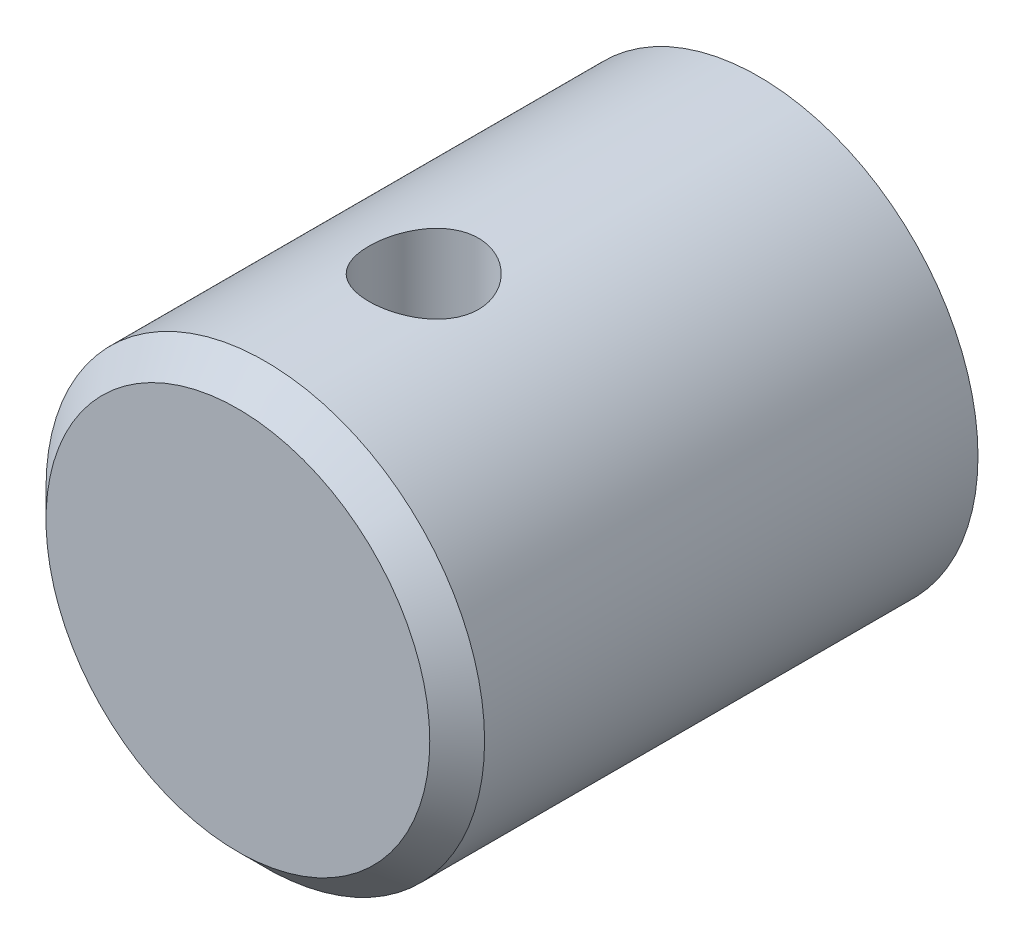
ISO-10303-21;
HEADER;
FILE_DESCRIPTION(('STEP AP214'),'2;1');
FILE_NAME('part.step','',(''),(''),'','','');
FILE_SCHEMA(('AUTOMOTIVE_DESIGN { 1 0 10303 214 1 1 1 1 }'));
ENDSEC;
DATA;
#1=APPLICATION_CONTEXT('core data for automotive mechanical design processes');
#2=APPLICATION_PROTOCOL_DEFINITION('international standard','automotive_design',2000,#1);
#3=PRODUCT_CONTEXT('',#1,'mechanical');
#4=PRODUCT('Part','Part','',(#3));
#5=PRODUCT_RELATED_PRODUCT_CATEGORY('part','',(#4));
#6=PRODUCT_DEFINITION_FORMATION('','',#4);
#7=PRODUCT_DEFINITION_CONTEXT('part definition',#1,'design');
#8=PRODUCT_DEFINITION('design','',#6,#7);
#9=PRODUCT_DEFINITION_SHAPE('','',#8);
#10=(LENGTH_UNIT() NAMED_UNIT(*) SI_UNIT(.MILLI.,.METRE.));
#11=(NAMED_UNIT(*) PLANE_ANGLE_UNIT() SI_UNIT($,.RADIAN.));
#12=(NAMED_UNIT(*) SI_UNIT($,.STERADIAN.) SOLID_ANGLE_UNIT());
#13=UNCERTAINTY_MEASURE_WITH_UNIT(LENGTH_MEASURE(1.E-05),#10,'distance_accuracy_value','');
#14=(GEOMETRIC_REPRESENTATION_CONTEXT(3) GLOBAL_UNCERTAINTY_ASSIGNED_CONTEXT((#13)) GLOBAL_UNIT_ASSIGNED_CONTEXT((#10,
#11,#12)) REPRESENTATION_CONTEXT('',''));
#15=CARTESIAN_POINT('',(0.,0.,0.));
#16=DIRECTION('',(0.,0.,1.));
#17=DIRECTION('',(1.,0.,0.));
#18=AXIS2_PLACEMENT_3D('',#15,#16,#17);
#19=CARTESIAN_POINT('',(0.,0.,19.));
#20=DIRECTION('',(0.,0.,-1.));
#21=DIRECTION('',(-1.,0.,0.));
#22=AXIS2_PLACEMENT_3D('',#19,#20,#21);
#23=CYLINDRICAL_SURFACE('',#22,8.00000000000001);
#24=CARTESIAN_POINT('',(0.,0.,18.));
#25=DIRECTION('',(0.,0.,1.));
#26=DIRECTION('',(1.,0.,0.));
#27=AXIS2_PLACEMENT_3D('',#24,#25,#26);
#28=CIRCLE('',#27,8.00000000000001);
#29=CARTESIAN_POINT('',(8.00000000000001,0.,18.));
#30=VERTEX_POINT('',#29);
#31=EDGE_CURVE('E10',#30,#30,#28,.F.);
#32=ORIENTED_EDGE('',*,*,#31,.T.);
#33=EDGE_LOOP('',(#32));
#34=FACE_BOUND('',#33,.T.);
#35=CARTESIAN_POINT('',(0.,-8.00000000000001,14.2213121535534));
#36=CARTESIAN_POINT('',(0.110501451559641,-7.9999981315735,14.2213090525692));
#37=CARTESIAN_POINT('',(0.221037543774351,-7.99768770842436,14.2121234191884));
#38=CARTESIAN_POINT('',(0.438941765027376,-7.98869485106526,14.1756786184774));
#39=CARTESIAN_POINT('',(0.546308062494318,-7.98200993893302,14.1484092075029));
#40=CARTESIAN_POINT('',(0.754694496243435,-7.96500835109377,14.0767264822706));
#41=CARTESIAN_POINT('',(0.855722084573336,-7.95469603789412,14.0323337552664));
#42=CARTESIAN_POINT('',(1.04889617587257,-7.93153791743496,13.927736966827));
#43=CARTESIAN_POINT('',(1.14104237913168,-7.91869202472209,13.8675323720614));
#44=CARTESIAN_POINT('',(1.31573590306789,-7.89156551455592,13.7317111006812));
#45=CARTESIAN_POINT('',(1.39807425341474,-7.87726276197502,13.655830053608));
#46=CARTESIAN_POINT('',(1.54899856960443,-7.84898160157249,13.4913758803414));
#47=CARTESIAN_POINT('',(1.61758298259892,-7.83500323053157,13.4028013229575));
#48=CARTESIAN_POINT('',(1.74003539039863,-7.80873034264225,13.2138518512374));
#49=CARTESIAN_POINT('',(1.79366962123352,-7.79646392619749,13.1133211791418));
#50=CARTESIAN_POINT('',(1.88319587806766,-7.77532659757356,12.90431427134));
#51=CARTESIAN_POINT('',(1.91909074058685,-7.76645514259225,12.7958393091107));
#52=CARTESIAN_POINT('',(1.97140644907302,-7.75333968928431,12.5763208226179));
#53=CARTESIAN_POINT('',(1.98820302444274,-7.74900654662682,12.4653722921694));
#54=CARTESIAN_POINT('',(2.00301570008854,-7.74519149946123,12.2421540615543));
#55=CARTESIAN_POINT('',(2.00103485575748,-7.74570880570572,12.1298845792972));
#56=CARTESIAN_POINT('',(1.97864869951961,-7.75145607355757,11.9100910765596));
#57=CARTESIAN_POINT('',(1.95869112025418,-7.75657150676392,11.8025179915996));
#58=CARTESIAN_POINT('',(1.90163224920399,-7.77075612894759,11.5922974190053));
#59=CARTESIAN_POINT('',(1.86452973609252,-7.77982559958985,11.4896502828482));
#60=CARTESIAN_POINT('',(1.77385263724958,-7.80100151874213,11.2909947985506));
#61=CARTESIAN_POINT('',(1.72011555631056,-7.81313769959755,11.1950639245006));
#62=CARTESIAN_POINT('',(1.59780836801993,-7.83906281127989,11.0134205405443));
#63=CARTESIAN_POINT('',(1.52923566507845,-7.85285203112838,10.9277098227971));
#64=CARTESIAN_POINT('',(1.37688456624163,-7.88101174053189,10.7663739992942));
#65=CARTESIAN_POINT('',(1.29272834422115,-7.89538759304002,10.6911061668049));
#66=CARTESIAN_POINT('',(1.11281589000493,-7.92274620771676,10.5556838302682));
#67=CARTESIAN_POINT('',(1.01705930361059,-7.93572892732544,10.4955297878686));
#68=CARTESIAN_POINT('',(0.816154518241856,-7.95890309458921,10.3919113719209));
#69=CARTESIAN_POINT('',(0.710975190944831,-7.96908480170304,10.3485050332142));
#70=CARTESIAN_POINT('',(0.49450134419051,-7.98543889321889,10.280089079274));
#71=CARTESIAN_POINT('',(0.383207998867313,-7.99161204452374,10.2550759449959));
#72=CARTESIAN_POINT('',(0.160719960520035,-7.99913999028501,10.2247020661416));
#73=CARTESIAN_POINT('',(0.0495956266509457,-8.00061404677706,10.218854785453));
#74=CARTESIAN_POINT('',(-0.172043833068678,-7.99891739752602,10.2256441562941));
#75=CARTESIAN_POINT('',(-0.28255901285946,-7.99574710989129,10.2382791439522));
#76=CARTESIAN_POINT('',(-0.498152358368656,-7.98519441503143,10.2812733647419));
#77=CARTESIAN_POINT('',(-0.603286825291673,-7.97787512247749,10.3113671715227));
#78=CARTESIAN_POINT('',(-0.807009723270015,-7.95984942178846,10.3881215989247));
#79=CARTESIAN_POINT('',(-0.905597492043513,-7.94914267159857,10.4347838926376));
#80=CARTESIAN_POINT('',(-1.0953641792398,-7.92524410568415,10.5442936587197));
#81=CARTESIAN_POINT('',(-1.18638058911444,-7.91201156489244,10.6074136367491));
#82=CARTESIAN_POINT('',(-1.35670215152433,-7.88459345583227,10.747698698616));
#83=CARTESIAN_POINT('',(-1.43600527863068,-7.87040772335607,10.8248662063759));
#84=CARTESIAN_POINT('',(-1.58265409076364,-7.84225275947695,10.9933147680127));
#85=CARTESIAN_POINT('',(-1.64965849016271,-7.82829738916375,11.0848957575566));
#86=CARTESIAN_POINT('',(-1.7673476786836,-7.80257171169652,11.2782889995077));
#87=CARTESIAN_POINT('',(-1.81803319221058,-7.79080130756036,11.3801007974997));
#88=CARTESIAN_POINT('',(-1.90126856081239,-7.77090792979554,11.5905197834375));
#89=CARTESIAN_POINT('',(-1.93392586220542,-7.76276340389208,11.6990823246787));
#90=CARTESIAN_POINT('',(-1.98046087993837,-7.75102325453579,11.9203916707389));
#91=CARTESIAN_POINT('',(-1.99434270330488,-7.74742663626582,12.0331375549301));
#92=CARTESIAN_POINT('',(-2.00271812044533,-7.7452653493861,12.2561401853603));
#93=CARTESIAN_POINT('',(-1.99775719704016,-7.74655910304352,12.3663754003864));
#94=CARTESIAN_POINT('',(-1.96983637108382,-7.75370545343791,12.5843840051107));
#95=CARTESIAN_POINT('',(-1.94687683024903,-7.7595579585581,12.6921574442383));
#96=CARTESIAN_POINT('',(-1.88390842592373,-7.77508347576964,12.9015900989739));
#97=CARTESIAN_POINT('',(-1.84400187290717,-7.78473353648413,13.0032818938737));
#98=CARTESIAN_POINT('',(-1.74835321814009,-7.80677007633106,13.198599330505));
#99=CARTESIAN_POINT('',(-1.69260892004558,-7.81915693494365,13.292223851136));
#100=CARTESIAN_POINT('',(-1.56515699818285,-7.8456751235135,13.4713849922228));
#101=CARTESIAN_POINT('',(-1.49307088388301,-7.8598435310901,13.5566469181187));
#102=CARTESIAN_POINT('',(-1.33571916158631,-7.88810702995048,13.7140415466139));
#103=CARTESIAN_POINT('',(-1.25045042834819,-7.90220210302747,13.7861711270374));
#104=CARTESIAN_POINT('',(-1.06729011560345,-7.92903540863551,13.9165272316395));
#105=CARTESIAN_POINT('',(-0.969197896421848,-7.94174444487825,13.9744783051155));
#106=CARTESIAN_POINT('',(-0.764354746013967,-7.96406566633492,14.0729754374741));
#107=CARTESIAN_POINT('',(-0.657610084582318,-7.97368006933042,14.1135339677515));
#108=CARTESIAN_POINT('',(-0.459213670991295,-7.98730746087389,14.1700745939929));
#109=CARTESIAN_POINT('',(-0.368506894544091,-7.99203446736921,14.1892471442913));
#110=CARTESIAN_POINT('',(-0.185208095381711,-7.99838140309265,14.2148667450493));
#111=CARTESIAN_POINT('',(-0.0926162149901549,-8.00000156601193,14.2213147526271));
#112=CARTESIAN_POINT('',(0.,-8.00000000000001,14.2213121535534));
#113=B_SPLINE_CURVE_WITH_KNOTS('',3,(#35,#36,#37,#38,#39,#40,#41,#42,#43,#44,#45,#46,#47,#48,
#49,#50,#51,#52,#53,#54,#55,#56,#57,#58,#59,#60,#61,#62,#63,#64,#65,#66,#67,#68,#69,#70,#71,#72,
#73,#74,#75,#76,#77,#78,#79,#80,#81,#82,#83,#84,#85,#86,#87,#88,#89,#90,#91,#92,#93,#94,#95,#96,
#97,#98,#99,#100,#101,#102,#103,#104,#105,#106,#107,#108,#109,#110,#111,#112),.UNSPECIFIED.,.T.,
.F.,(4,2,2,2,2,2,2,2,2,2,2,2,2,2,2,2,2,2,2,2,2,2,2,2,2,2,2,2,2,2,2,2,2,2,2,2,2,2,4),(0.,
0.331164949962519,0.662517650351865,0.99347320304814,1.32443992022577,1.66152580582852,
1.99864972773416,2.34078196727742,2.68285948225824,3.01808393468093,3.3532538415469,
3.68029996013785,4.00736937959146,4.337740371696,4.66816921119311,5.00802001296453,
5.34788119415424,5.6889097201658,6.02987298255951,6.36211078603463,6.69431868154751,
7.02160366023144,7.34892169767481,7.68204783424897,8.01523150681786,8.35659345610395,
8.69794025003772,9.03723006156476,9.37644564340971,9.70591707202577,10.0353818794581,
10.3628853408369,10.6904342418696,11.0265276855097,11.3627009303165,11.7049624733721,
12.0469781843289,12.3245632392729,12.6021274139515),.UNSPECIFIED.);
#114=CARTESIAN_POINT('',(0.,-8.00000000000001,14.2213121535534));
#115=VERTEX_POINT('',#114);
#116=EDGE_CURVE('E58',#115,#115,#113,.T.);
#117=ORIENTED_EDGE('',*,*,#116,.T.);
#118=EDGE_LOOP('',(#117));
#119=FACE_BOUND('',#118,.T.);
#120=CARTESIAN_POINT('',(0.,8.00000000000001,14.2213121535534));
#121=CARTESIAN_POINT('',(-0.110501451559641,7.9999981315735,14.2213090525692));
#122=CARTESIAN_POINT('',(-0.221037543774351,7.99768770842436,14.2121234191884));
#123=CARTESIAN_POINT('',(-0.438941765027377,7.98869485106526,14.1756786184774));
#124=CARTESIAN_POINT('',(-0.54630806249432,7.98200993893302,14.1484092075029));
#125=CARTESIAN_POINT('',(-0.754694496243437,7.96500835109377,14.0767264822706));
#126=CARTESIAN_POINT('',(-0.855722084573337,7.95469603789412,14.0323337552664));
#127=CARTESIAN_POINT('',(-1.04889617587257,7.93153791743496,13.9277369668269));
#128=CARTESIAN_POINT('',(-1.14104237913169,7.91869202472209,13.8675323720614));
#129=CARTESIAN_POINT('',(-1.31573590306789,7.89156551455592,13.7317111006812));
#130=CARTESIAN_POINT('',(-1.39807425341474,7.87726276197502,13.655830053608));
#131=CARTESIAN_POINT('',(-1.54899856960443,7.84898160157249,13.4913758803414));
#132=CARTESIAN_POINT('',(-1.61758298259892,7.83500323053157,13.4028013229575));
#133=CARTESIAN_POINT('',(-1.74003539039863,7.80873034264225,13.2138518512374));
#134=CARTESIAN_POINT('',(-1.79366962123352,7.79646392619749,13.1133211791418));
#135=CARTESIAN_POINT('',(-1.88319587806766,7.77532659757356,12.90431427134));
#136=CARTESIAN_POINT('',(-1.91909074058686,7.76645514259225,12.7958393091107));
#137=CARTESIAN_POINT('',(-1.97140644907302,7.75333968928431,12.5763208226179));
#138=CARTESIAN_POINT('',(-1.98820302444274,7.74900654662682,12.4653722921694));
#139=CARTESIAN_POINT('',(-2.00301570008854,7.74519149946123,12.2421540615543));
#140=CARTESIAN_POINT('',(-2.00103485575748,7.74570880570572,12.1298845792972));
#141=CARTESIAN_POINT('',(-1.97864869951961,7.75145607355757,11.9100910765596));
#142=CARTESIAN_POINT('',(-1.95869112025418,7.75657150676392,11.8025179915996));
#143=CARTESIAN_POINT('',(-1.90163224920399,7.77075612894759,11.5922974190053));
#144=CARTESIAN_POINT('',(-1.86452973609252,7.77982559958986,11.4896502828482));
#145=CARTESIAN_POINT('',(-1.77385263724958,7.80100151874213,11.2909947985506));
#146=CARTESIAN_POINT('',(-1.72011555631056,7.81313769959755,11.1950639245006));
#147=CARTESIAN_POINT('',(-1.59780836801993,7.83906281127989,11.0134205405443));
#148=CARTESIAN_POINT('',(-1.52923566507845,7.85285203112838,10.9277098227971));
#149=CARTESIAN_POINT('',(-1.37688456624163,7.88101174053189,10.7663739992942));
#150=CARTESIAN_POINT('',(-1.29272834422115,7.89538759304002,10.6911061668049));
#151=CARTESIAN_POINT('',(-1.11281589000493,7.92274620771676,10.5556838302682));
#152=CARTESIAN_POINT('',(-1.01705930361059,7.93572892732544,10.4955297878686));
#153=CARTESIAN_POINT('',(-0.816154518241857,7.95890309458921,10.3919113719209));
#154=CARTESIAN_POINT('',(-0.710975190944832,7.96908480170304,10.3485050332142));
#155=CARTESIAN_POINT('',(-0.494501344190511,7.98543889321889,10.280089079274));
#156=CARTESIAN_POINT('',(-0.383207998867314,7.99161204452374,10.2550759449959));
#157=CARTESIAN_POINT('',(-0.160719960520036,7.99913999028501,10.2247020661416));
#158=CARTESIAN_POINT('',(-0.0495956266509466,8.00061404677706,10.218854785453));
#159=CARTESIAN_POINT('',(0.172043833068677,7.99891739752602,10.2256441562941));
#160=CARTESIAN_POINT('',(0.28255901285946,7.99574710989129,10.2382791439522));
#161=CARTESIAN_POINT('',(0.498152358368656,7.98519441503143,10.2812733647419));
#162=CARTESIAN_POINT('',(0.603286825291673,7.97787512247749,10.3113671715227));
#163=CARTESIAN_POINT('',(0.807009723270016,7.95984942178846,10.3881215989247));
#164=CARTESIAN_POINT('',(0.905597492043513,7.94914267159857,10.4347838926376));
#165=CARTESIAN_POINT('',(1.0953641792398,7.92524410568415,10.5442936587197));
#166=CARTESIAN_POINT('',(1.18638058911444,7.91201156489244,10.6074136367491));
#167=CARTESIAN_POINT('',(1.35670215152433,7.88459345583227,10.747698698616));
#168=CARTESIAN_POINT('',(1.43600527863068,7.87040772335607,10.8248662063759));
#169=CARTESIAN_POINT('',(1.58265409076364,7.84225275947695,10.9933147680127));
#170=CARTESIAN_POINT('',(1.64965849016271,7.82829738916375,11.0848957575566));
#171=CARTESIAN_POINT('',(1.7673476786836,7.80257171169652,11.2782889995077));
#172=CARTESIAN_POINT('',(1.81803319221058,7.79080130756036,11.3801007974997));
#173=CARTESIAN_POINT('',(1.90126856081239,7.77090792979554,11.5905197834375));
#174=CARTESIAN_POINT('',(1.93392586220542,7.76276340389208,11.6990823246788));
#175=CARTESIAN_POINT('',(1.98046087993837,7.75102325453579,11.9203916707389));
#176=CARTESIAN_POINT('',(1.99434270330488,7.74742663626582,12.0331375549301));
#177=CARTESIAN_POINT('',(2.00271812044533,7.7452653493861,12.2561401853603));
#178=CARTESIAN_POINT('',(1.99775719704016,7.74655910304352,12.3663754003864));
#179=CARTESIAN_POINT('',(1.96983637108382,7.75370545343791,12.5843840051107));
#180=CARTESIAN_POINT('',(1.94687683024903,7.7595579585581,12.6921574442383));
#181=CARTESIAN_POINT('',(1.88390842592373,7.77508347576964,12.9015900989739));
#182=CARTESIAN_POINT('',(1.84400187290717,7.78473353648413,13.0032818938737));
#183=CARTESIAN_POINT('',(1.74835321814009,7.80677007633105,13.198599330505));
#184=CARTESIAN_POINT('',(1.69260892004558,7.81915693494365,13.292223851136));
#185=CARTESIAN_POINT('',(1.56515699818285,7.8456751235135,13.4713849922228));
#186=CARTESIAN_POINT('',(1.49307088388301,7.8598435310901,13.5566469181187));
#187=CARTESIAN_POINT('',(1.33571916158631,7.88810702995048,13.7140415466139));
#188=CARTESIAN_POINT('',(1.25045042834819,7.90220210302747,13.7861711270374));
#189=CARTESIAN_POINT('',(1.06729011560345,7.92903540863551,13.9165272316395));
#190=CARTESIAN_POINT('',(0.96919789642185,7.94174444487825,13.9744783051155));
#191=CARTESIAN_POINT('',(0.764354746013969,7.96406566633492,14.0729754374741));
#192=CARTESIAN_POINT('',(0.65761008458232,7.97368006933042,14.1135339677515));
#193=CARTESIAN_POINT('',(0.459213670991296,7.98730746087389,14.1700745939929));
#194=CARTESIAN_POINT('',(0.368506894544092,7.99203446736921,14.1892471442913));
#195=CARTESIAN_POINT('',(0.185208095381712,7.99838140309265,14.2148667450493));
#196=CARTESIAN_POINT('',(0.0926162149901554,8.00000156601193,14.2213147526271));
#197=CARTESIAN_POINT('',(0.,8.00000000000001,14.2213121535534));
#198=B_SPLINE_CURVE_WITH_KNOTS('',3,(#120,#121,#122,#123,#124,#125,#126,#127,#128,#129,#130,
#131,#132,#133,#134,#135,#136,#137,#138,#139,#140,#141,#142,#143,#144,#145,#146,#147,#148,#149,
#150,#151,#152,#153,#154,#155,#156,#157,#158,#159,#160,#161,#162,#163,#164,#165,#166,#167,#168,
#169,#170,#171,#172,#173,#174,#175,#176,#177,#178,#179,#180,#181,#182,#183,#184,#185,#186,#187,
#188,#189,#190,#191,#192,#193,#194,#195,#196,#197),.UNSPECIFIED.,.T.,.F.,(4,2,2,2,2,2,2,2,2,2,2,
2,2,2,2,2,2,2,2,2,2,2,2,2,2,2,2,2,2,2,2,2,2,2,2,2,2,2,4),(0.,0.33116494996252,0.662517650351867,
0.993473203048143,1.32443992022577,1.66152580582852,1.99864972773416,2.34078196727743,
2.68285948225825,3.01808393468094,3.3532538415469,3.68029996013785,4.00736937959146,
4.337740371696,4.66816921119311,5.00802001296453,5.34788119415424,5.68890972016579,
6.02987298255951,6.36211078603463,6.69431868154751,7.02160366023144,7.34892169767482,
7.68204783424897,8.01523150681786,8.35659345610396,8.69794025003772,9.03723006156476,
9.37644564340972,9.70591707202578,10.0353818794581,10.3628853408369,10.6904342418696,
11.0265276855097,11.3627009303165,11.7049624733721,12.0469781843289,12.3245632392729,
12.6021274139515),.UNSPECIFIED.);
#199=CARTESIAN_POINT('',(0.,8.00000000000001,14.2213121535534));
#200=VERTEX_POINT('',#199);
#201=EDGE_CURVE('E68',#200,#200,#198,.T.);
#202=ORIENTED_EDGE('',*,*,#201,.T.);
#203=EDGE_LOOP('',(#202));
#204=FACE_BOUND('',#203,.T.);
#205=CARTESIAN_POINT('',(0.,0.,0.));
#206=DIRECTION('',(0.,0.,1.));
#207=DIRECTION('',(1.,0.,0.));
#208=AXIS2_PLACEMENT_3D('',#205,#206,#207);
#209=CIRCLE('',#208,8.00000000000001);
#210=CARTESIAN_POINT('',(8.00000000000001,0.,0.));
#211=VERTEX_POINT('',#210);
#212=EDGE_CURVE('E53',#211,#211,#209,.T.);
#213=ORIENTED_EDGE('',*,*,#212,.T.);
#214=EDGE_LOOP('',(#213));
#215=FACE_BOUND('',#214,.T.);
#216=ADVANCED_FACE('F39',(#34,#119,#204,#215),#23,.T.);
#217=CARTESIAN_POINT('',(0.,0.,19.));
#218=DIRECTION('',(0.,0.,1.));
#219=DIRECTION('',(1.,0.,0.));
#220=AXIS2_PLACEMENT_3D('',#217,#218,#219);
#221=PLANE('',#220);
#222=CARTESIAN_POINT('',(0.,0.,19.));
#223=DIRECTION('',(0.,0.,1.));
#224=DIRECTION('',(1.,0.,0.));
#225=AXIS2_PLACEMENT_3D('',#222,#223,#224);
#226=CIRCLE('',#225,7.00000000000001);
#227=CARTESIAN_POINT('',(7.00000000000001,0.,19.));
#228=VERTEX_POINT('',#227);
#229=EDGE_CURVE('E48',#228,#228,#226,.T.);
#230=ORIENTED_EDGE('',*,*,#229,.T.);
#231=EDGE_LOOP('',(#230));
#232=FACE_BOUND('',#231,.T.);
#233=ADVANCED_FACE('F80',(#232),#221,.T.);
#234=CARTESIAN_POINT('',(0.,0.,0.));
#235=DIRECTION('',(0.,0.,1.));
#236=DIRECTION('',(1.,0.,0.));
#237=AXIS2_PLACEMENT_3D('',#234,#235,#236);
#238=PLANE('',#237);
#239=ORIENTED_EDGE('',*,*,#212,.F.);
#240=EDGE_LOOP('',(#239));
#241=FACE_BOUND('',#240,.T.);
#242=ADVANCED_FACE('F78',(#241),#238,.F.);
#243=CARTESIAN_POINT('',(0.,-24.,12.2213121535534));
#244=DIRECTION('',(0.,1.,0.));
#245=DIRECTION('',(0.,0.,1.));
#246=AXIS2_PLACEMENT_3D('',#243,#244,#245);
#247=CYLINDRICAL_SURFACE('',#246,2.);
#248=ORIENTED_EDGE('',*,*,#201,.F.);
#249=EDGE_LOOP('',(#248));
#250=FACE_BOUND('',#249,.T.);
#251=ORIENTED_EDGE('',*,*,#116,.F.);
#252=EDGE_LOOP('',(#251));
#253=FACE_BOUND('',#252,.T.);
#254=ADVANCED_FACE('F74',(#250,#253),#247,.F.);
#255=CARTESIAN_POINT('',(0.,0.,19.));
#256=DIRECTION('',(0.,0.,-1.));
#257=DIRECTION('',(-1.,0.,0.));
#258=AXIS2_PLACEMENT_3D('',#255,#256,#257);
#259=CONICAL_SURFACE('',#258,7.00000000000001,0.785398163397447);
#260=ORIENTED_EDGE('',*,*,#31,.F.);
#261=EDGE_LOOP('',(#260));
#262=FACE_BOUND('',#261,.T.);
#263=ORIENTED_EDGE('',*,*,#229,.F.);
#264=EDGE_LOOP('',(#263));
#265=FACE_BOUND('',#264,.T.);
#266=ADVANCED_FACE('F42',(#262,#265),#259,.T.);
#267=CLOSED_SHELL('',(#216,#233,#242,#254,#266));
#268=MANIFOLD_SOLID_BREP('B2',#267);
#269=ADVANCED_BREP_SHAPE_REPRESENTATION('',(#18,#268),#14);
#270=SHAPE_DEFINITION_REPRESENTATION(#9,#269);
ENDSEC;
END-ISO-10303-21;
